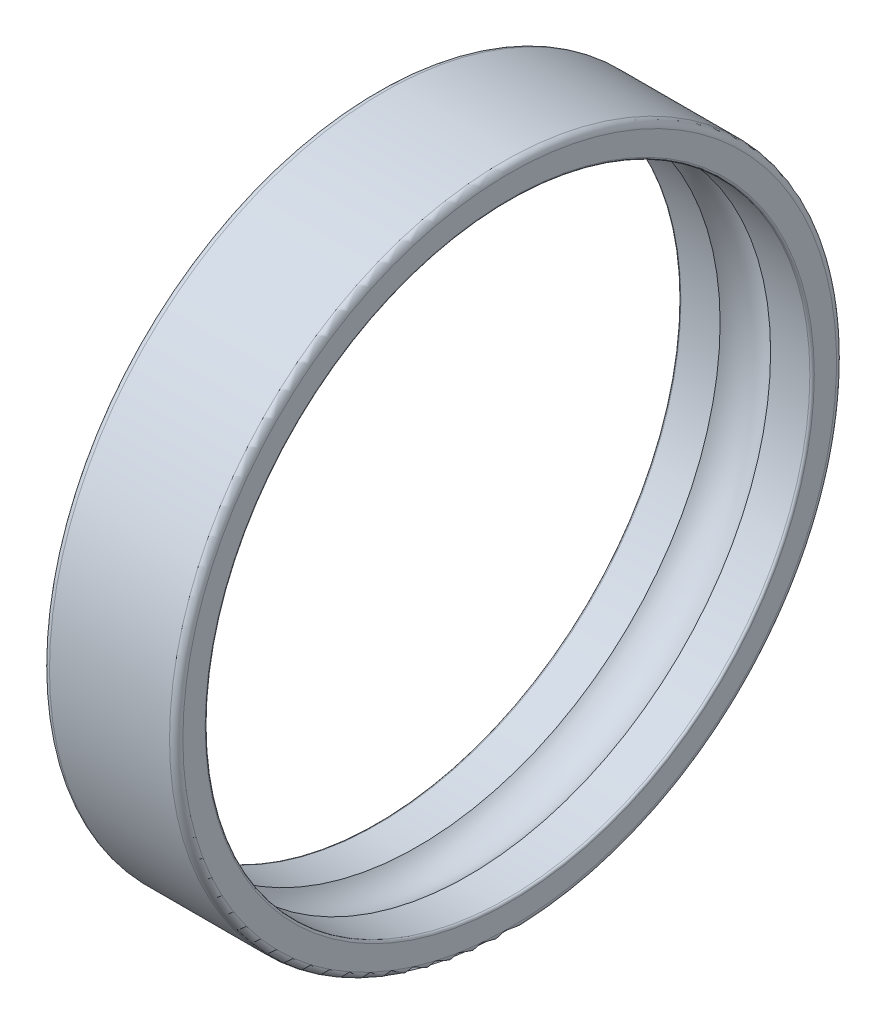
ISO-10303-21;
HEADER;
FILE_DESCRIPTION(('STEP AP214'),'2;1');
FILE_NAME('part.step','',(''),(''),'','','');
FILE_SCHEMA(('AUTOMOTIVE_DESIGN { 1 0 10303 214 1 1 1 1 }'));
ENDSEC;
DATA;
#1=APPLICATION_CONTEXT('core data for automotive mechanical design processes');
#2=APPLICATION_PROTOCOL_DEFINITION('international standard','automotive_design',2000,#1);
#3=PRODUCT_CONTEXT('',#1,'mechanical');
#4=PRODUCT('Part','Part','',(#3));
#5=PRODUCT_RELATED_PRODUCT_CATEGORY('part','',(#4));
#6=PRODUCT_DEFINITION_FORMATION('','',#4);
#7=PRODUCT_DEFINITION_CONTEXT('part definition',#1,'design');
#8=PRODUCT_DEFINITION('design','',#6,#7);
#9=PRODUCT_DEFINITION_SHAPE('','',#8);
#10=(LENGTH_UNIT() NAMED_UNIT(*) SI_UNIT(.MILLI.,.METRE.));
#11=(NAMED_UNIT(*) PLANE_ANGLE_UNIT() SI_UNIT($,.RADIAN.));
#12=(NAMED_UNIT(*) SI_UNIT($,.STERADIAN.) SOLID_ANGLE_UNIT());
#13=UNCERTAINTY_MEASURE_WITH_UNIT(LENGTH_MEASURE(1.E-05),#10,'distance_accuracy_value','');
#14=(GEOMETRIC_REPRESENTATION_CONTEXT(3) GLOBAL_UNCERTAINTY_ASSIGNED_CONTEXT((#13)) GLOBAL_UNIT_ASSIGNED_CONTEXT((#10,
#11,#12)) REPRESENTATION_CONTEXT('',''));
#15=CARTESIAN_POINT('',(0.,0.,0.));
#16=DIRECTION('',(0.,0.,1.));
#17=DIRECTION('',(1.,0.,0.));
#18=AXIS2_PLACEMENT_3D('',#15,#16,#17);
#19=CARTESIAN_POINT('',(0.,-7.55083108438204,-7.35));
#20=DIRECTION('',(-1.,0.,0.));
#21=DIRECTION('',(0.,0.,1.));
#22=AXIS2_PLACEMENT_3D('',#19,#20,#21);
#23=PLANE('',#22);
#24=CARTESIAN_POINT('',(0.,0.,0.));
#25=DIRECTION('',(-1.,0.,0.));
#26=DIRECTION('',(0.,0.,-1.));
#27=AXIS2_PLACEMENT_3D('',#24,#25,#26);
#28=CIRCLE('',#27,7.35);
#29=CARTESIAN_POINT('',(0.,0.,-7.35));
#30=VERTEX_POINT('',#29);
#31=EDGE_CURVE('E50',#30,#30,#28,.F.);
#32=ORIENTED_EDGE('',*,*,#31,.F.);
#33=EDGE_LOOP('',(#32));
#34=FACE_BOUND('',#33,.T.);
#35=CARTESIAN_POINT('',(0.,0.,0.));
#36=DIRECTION('',(1.,0.,0.));
#37=DIRECTION('',(0.,0.,1.));
#38=AXIS2_PLACEMENT_3D('',#35,#36,#37);
#39=CIRCLE('',#38,6.85000000414831);
#40=CARTESIAN_POINT('',(0.,0.,6.85000000414831));
#41=VERTEX_POINT('',#40);
#42=EDGE_CURVE('E47',#41,#41,#39,.T.);
#43=ORIENTED_EDGE('',*,*,#42,.T.);
#44=EDGE_LOOP('',(#43));
#45=FACE_BOUND('',#44,.T.);
#46=ADVANCED_FACE('F15',(#34,#45),#23,.T.);
#47=CARTESIAN_POINT('',(3.,-7.55083107625617,7.35));
#48=DIRECTION('',(1.,0.,0.));
#49=DIRECTION('',(0.,0.,-1.));
#50=AXIS2_PLACEMENT_3D('',#47,#48,#49);
#51=PLANE('',#50);
#52=CARTESIAN_POINT('',(3.,0.,0.));
#53=DIRECTION('',(1.,0.,0.));
#54=DIRECTION('',(0.,-1.16855749566565E-09,1.));
#55=AXIS2_PLACEMENT_3D('',#52,#53,#54);
#56=CIRCLE('',#55,7.35000002663517);
#57=CARTESIAN_POINT('',(3.,-8.58889762426725E-09,7.35000002663517));
#58=VERTEX_POINT('',#57);
#59=EDGE_CURVE('E44',#58,#58,#56,.T.);
#60=ORIENTED_EDGE('',*,*,#59,.T.);
#61=EDGE_LOOP('',(#60));
#62=FACE_BOUND('',#61,.T.);
#63=CARTESIAN_POINT('',(3.,0.,0.));
#64=DIRECTION('',(-1.,0.,0.));
#65=DIRECTION('',(0.,0.,-1.));
#66=AXIS2_PLACEMENT_3D('',#63,#64,#65);
#67=CIRCLE('',#66,6.85);
#68=CARTESIAN_POINT('',(3.,0.,-6.85));
#69=VERTEX_POINT('',#68);
#70=EDGE_CURVE('E41',#69,#69,#67,.F.);
#71=ORIENTED_EDGE('',*,*,#70,.F.);
#72=EDGE_LOOP('',(#71));
#73=FACE_BOUND('',#72,.T.);
#74=ADVANCED_FACE('F58',(#62,#73),#51,.T.);
#75=CARTESIAN_POINT('',(0.0500000000000471,0.,0.));
#76=DIRECTION('',(1.,0.,0.));
#77=DIRECTION('',(0.,0.,1.));
#78=AXIS2_PLACEMENT_3D('',#75,#76,#77);
#79=TOROIDAL_SURFACE('',#78,6.85,0.0500000000000471);
#80=CARTESIAN_POINT('',(0.05,0.,0.));
#81=DIRECTION('',(1.,0.,0.));
#82=DIRECTION('',(0.,0.,1.));
#83=AXIS2_PLACEMENT_3D('',#80,#81,#82);
#84=CIRCLE('',#83,6.79999999999995);
#85=CARTESIAN_POINT('',(0.05,0.,6.79999999999995));
#86=VERTEX_POINT('',#85);
#87=EDGE_CURVE('E38',#86,#86,#84,.T.);
#88=ORIENTED_EDGE('',*,*,#87,.T.);
#89=EDGE_LOOP('',(#88));
#90=FACE_BOUND('',#89,.T.);
#91=ORIENTED_EDGE('',*,*,#42,.F.);
#92=EDGE_LOOP('',(#91));
#93=FACE_BOUND('',#92,.T.);
#94=ADVANCED_FACE('F62',(#90,#93),#79,.T.);
#95=CARTESIAN_POINT('',(3.,0.,0.));
#96=DIRECTION('',(1.,0.,0.));
#97=DIRECTION('',(0.,0.,1.));
#98=AXIS2_PLACEMENT_3D('',#95,#96,#97);
#99=CYLINDRICAL_SURFACE('',#98,6.8);
#100=CARTESIAN_POINT('',(0.93218753095762,0.,0.));
#101=DIRECTION('',(1.,0.,0.));
#102=DIRECTION('',(0.,0.,1.));
#103=AXIS2_PLACEMENT_3D('',#100,#101,#102);
#104=CIRCLE('',#103,6.8);
#105=CARTESIAN_POINT('',(0.93218753095762,0.,6.8));
#106=VERTEX_POINT('',#105);
#107=EDGE_CURVE('E35',#106,#106,#104,.T.);
#108=ORIENTED_EDGE('',*,*,#107,.T.);
#109=EDGE_LOOP('',(#108));
#110=FACE_BOUND('',#109,.T.);
#111=ORIENTED_EDGE('',*,*,#87,.F.);
#112=EDGE_LOOP('',(#111));
#113=FACE_BOUND('',#112,.T.);
#114=ADVANCED_FACE('F64',(#110,#113),#99,.F.);
#115=CARTESIAN_POINT('',(1.5,0.,0.));
#116=DIRECTION('',(1.,0.,0.));
#117=DIRECTION('',(0.,0.,1.));
#118=AXIS2_PLACEMENT_3D('',#115,#116,#117);
#119=TOROIDAL_SURFACE('',#118,6.245,0.79400000000003);
#120=ORIENTED_EDGE('',*,*,#107,.F.);
#121=EDGE_LOOP('',(#120));
#122=FACE_BOUND('',#121,.T.);
#123=CARTESIAN_POINT('',(2.06781246904241,0.,0.));
#124=DIRECTION('',(1.,0.,0.));
#125=DIRECTION('',(0.,0.,1.));
#126=AXIS2_PLACEMENT_3D('',#123,#124,#125);
#127=CIRCLE('',#126,6.80000000000001);
#128=CARTESIAN_POINT('',(2.06781246904241,0.,6.80000000000001));
#129=VERTEX_POINT('',#128);
#130=EDGE_CURVE('E30',#129,#129,#127,.T.);
#131=ORIENTED_EDGE('',*,*,#130,.T.);
#132=EDGE_LOOP('',(#131));
#133=FACE_BOUND('',#132,.T.);
#134=ADVANCED_FACE('F72',(#122,#133),#119,.F.);
#135=CARTESIAN_POINT('',(3.,0.,0.));
#136=DIRECTION('',(1.,0.,0.));
#137=DIRECTION('',(0.,0.,1.));
#138=AXIS2_PLACEMENT_3D('',#135,#136,#137);
#139=CYLINDRICAL_SURFACE('',#138,6.8);
#140=CARTESIAN_POINT('',(2.95,0.,0.));
#141=DIRECTION('',(1.,0.,0.));
#142=DIRECTION('',(0.,0.,1.));
#143=AXIS2_PLACEMENT_3D('',#140,#141,#142);
#144=CIRCLE('',#143,6.8);
#145=CARTESIAN_POINT('',(2.95,0.,6.8));
#146=VERTEX_POINT('',#145);
#147=EDGE_CURVE('E26',#146,#146,#144,.T.);
#148=ORIENTED_EDGE('',*,*,#147,.T.);
#149=EDGE_LOOP('',(#148));
#150=FACE_BOUND('',#149,.T.);
#151=ORIENTED_EDGE('',*,*,#130,.F.);
#152=EDGE_LOOP('',(#151));
#153=FACE_BOUND('',#152,.T.);
#154=ADVANCED_FACE('F80',(#150,#153),#139,.F.);
#155=CARTESIAN_POINT('',(2.94999999999991,0.,0.));
#156=DIRECTION('',(1.,0.,0.));
#157=DIRECTION('',(0.,7.69350039571545E-10,1.));
#158=AXIS2_PLACEMENT_3D('',#155,#156,#157);
#159=TOROIDAL_SURFACE('',#158,6.85000000000009,0.0500000000000934);
#160=ORIENTED_EDGE('',*,*,#70,.T.);
#161=EDGE_LOOP('',(#160));
#162=FACE_BOUND('',#161,.T.);
#163=ORIENTED_EDGE('',*,*,#147,.F.);
#164=EDGE_LOOP('',(#163));
#165=FACE_BOUND('',#164,.T.);
#166=ADVANCED_FACE('F84',(#162,#165),#159,.T.);
#167=CARTESIAN_POINT('',(2.85000000000007,0.,0.));
#168=DIRECTION('',(1.,0.,0.));
#169=DIRECTION('',(0.,0.,1.));
#170=AXIS2_PLACEMENT_3D('',#167,#168,#169);
#171=TOROIDAL_SURFACE('',#170,7.35,0.149999999999937);
#172=CARTESIAN_POINT('',(2.85000000000007,0.,0.));
#173=DIRECTION('',(1.,0.,0.));
#174=DIRECTION('',(0.,0.,1.));
#175=AXIS2_PLACEMENT_3D('',#172,#173,#174);
#176=CIRCLE('',#175,7.49999999999994);
#177=CARTESIAN_POINT('',(2.85000000000007,0.,7.49999999999994));
#178=VERTEX_POINT('',#177);
#179=EDGE_CURVE('E22',#178,#178,#176,.T.);
#180=ORIENTED_EDGE('',*,*,#179,.T.);
#181=EDGE_LOOP('',(#180));
#182=FACE_BOUND('',#181,.T.);
#183=ORIENTED_EDGE('',*,*,#59,.F.);
#184=EDGE_LOOP('',(#183));
#185=FACE_BOUND('',#184,.T.);
#186=ADVANCED_FACE('F88',(#182,#185),#171,.T.);
#187=CARTESIAN_POINT('',(3.,0.,0.));
#188=DIRECTION('',(1.,0.,0.));
#189=DIRECTION('',(0.,0.,1.));
#190=AXIS2_PLACEMENT_3D('',#187,#188,#189);
#191=CYLINDRICAL_SURFACE('',#190,7.5);
#192=CARTESIAN_POINT('',(0.149999999999984,0.,0.));
#193=DIRECTION('',(1.,0.,0.));
#194=DIRECTION('',(0.,0.,1.));
#195=AXIS2_PLACEMENT_3D('',#192,#193,#194);
#196=CIRCLE('',#195,7.5);
#197=CARTESIAN_POINT('',(0.149999999999984,0.,7.5));
#198=VERTEX_POINT('',#197);
#199=EDGE_CURVE('E10',#198,#198,#196,.T.);
#200=ORIENTED_EDGE('',*,*,#199,.T.);
#201=EDGE_LOOP('',(#200));
#202=FACE_BOUND('',#201,.T.);
#203=ORIENTED_EDGE('',*,*,#179,.F.);
#204=EDGE_LOOP('',(#203));
#205=FACE_BOUND('',#204,.T.);
#206=ADVANCED_FACE('F91',(#202,#205),#191,.T.);
#207=CARTESIAN_POINT('',(0.149999999999968,0.,0.));
#208=DIRECTION('',(1.,0.,0.));
#209=DIRECTION('',(0.,1.16855781751732E-09,1.));
#210=AXIS2_PLACEMENT_3D('',#207,#208,#209);
#211=TOROIDAL_SURFACE('',#210,7.35,0.149999999999968);
#212=ORIENTED_EDGE('',*,*,#31,.T.);
#213=EDGE_LOOP('',(#212));
#214=FACE_BOUND('',#213,.T.);
#215=ORIENTED_EDGE('',*,*,#199,.F.);
#216=EDGE_LOOP('',(#215));
#217=FACE_BOUND('',#216,.T.);
#218=ADVANCED_FACE('F17',(#214,#217),#211,.T.);
#219=CLOSED_SHELL('',(#46,#74,#94,#114,#134,#154,#166,#186,#206,#218));
#220=MANIFOLD_SOLID_BREP('B1',#219);
#221=ADVANCED_BREP_SHAPE_REPRESENTATION('',(#18,#220),#14);
#222=SHAPE_DEFINITION_REPRESENTATION(#9,#221);
ENDSEC;
END-ISO-10303-21;
